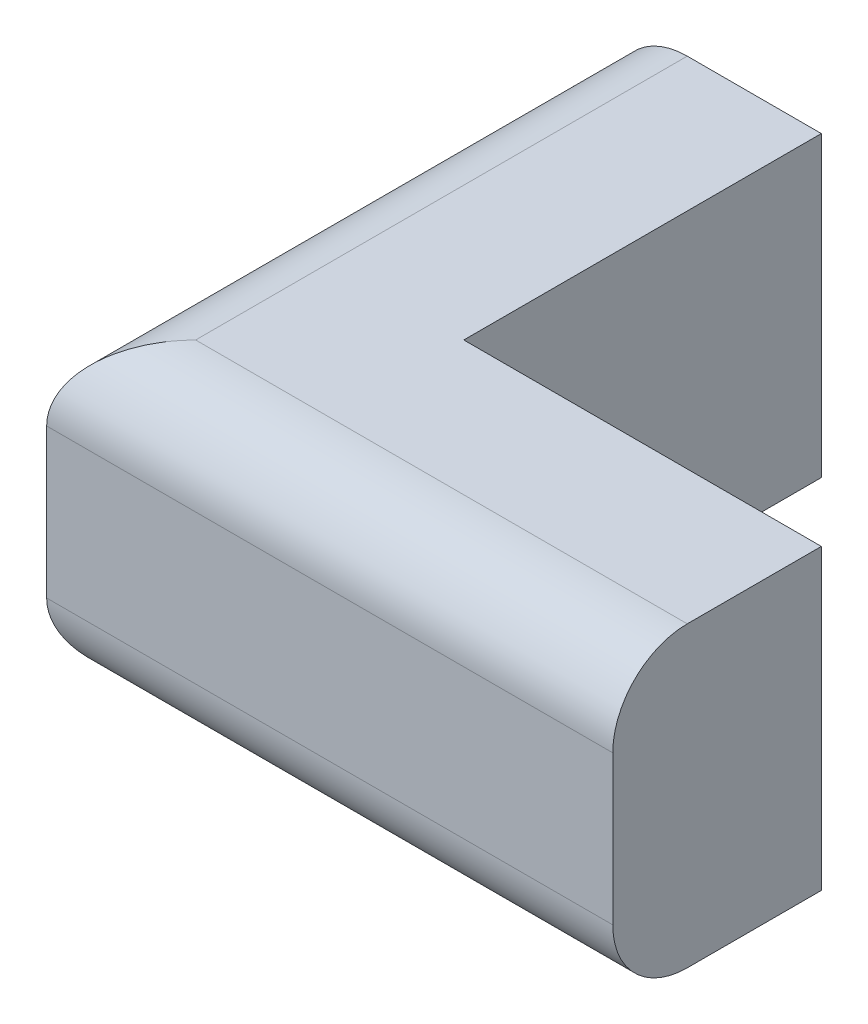
ISO-10303-21;
HEADER;
FILE_DESCRIPTION(('STEP AP214'),'2;1');
FILE_NAME('part.step','',(''),(''),'','','');
FILE_SCHEMA(('AUTOMOTIVE_DESIGN { 1 0 10303 214 1 1 1 1 }'));
ENDSEC;
DATA;
#1=APPLICATION_CONTEXT('core data for automotive mechanical design processes');
#2=APPLICATION_PROTOCOL_DEFINITION('international standard','automotive_design',2000,#1);
#3=PRODUCT_CONTEXT('',#1,'mechanical');
#4=PRODUCT('Part','Part','',(#3));
#5=PRODUCT_RELATED_PRODUCT_CATEGORY('part','',(#4));
#6=PRODUCT_DEFINITION_FORMATION('','',#4);
#7=PRODUCT_DEFINITION_CONTEXT('part definition',#1,'design');
#8=PRODUCT_DEFINITION('design','',#6,#7);
#9=PRODUCT_DEFINITION_SHAPE('','',#8);
#10=(LENGTH_UNIT() NAMED_UNIT(*) SI_UNIT(.MILLI.,.METRE.));
#11=(NAMED_UNIT(*) PLANE_ANGLE_UNIT() SI_UNIT($,.RADIAN.));
#12=(NAMED_UNIT(*) SI_UNIT($,.STERADIAN.) SOLID_ANGLE_UNIT());
#13=UNCERTAINTY_MEASURE_WITH_UNIT(LENGTH_MEASURE(1.E-05),#10,'distance_accuracy_value','');
#14=(GEOMETRIC_REPRESENTATION_CONTEXT(3) GLOBAL_UNCERTAINTY_ASSIGNED_CONTEXT((#13)) GLOBAL_UNIT_ASSIGNED_CONTEXT((#10,
#11,#12)) REPRESENTATION_CONTEXT('',''));
#15=CARTESIAN_POINT('',(0.,0.,0.));
#16=DIRECTION('',(0.,0.,1.));
#17=DIRECTION('',(1.,0.,0.));
#18=AXIS2_PLACEMENT_3D('',#15,#16,#17);
#19=CARTESIAN_POINT('',(0.,127.,-88.9));
#20=DIRECTION('',(0.,0.,-1.));
#21=DIRECTION('',(-1.,0.,0.));
#22=AXIS2_PLACEMENT_3D('',#19,#20,#21);
#23=PLANE('',#22);
#24=DIRECTION('',(1.,0.,0.));
#25=VECTOR('',#24,1.);
#26=CARTESIAN_POINT('',(0.,0.,-88.9));
#27=LINE('',#26,#25);
#28=CARTESIAN_POINT('',(88.9,0.,-88.9));
#29=VERTEX_POINT('',#28);
#30=CARTESIAN_POINT('',(241.3,0.,-88.9));
#31=VERTEX_POINT('',#30);
#32=EDGE_CURVE('E106',#29,#31,#27,.T.);
#33=ORIENTED_EDGE('',*,*,#32,.F.);
#34=DIRECTION('',(0.,-1.,0.));
#35=VECTOR('',#34,1.);
#36=CARTESIAN_POINT('',(88.9,127.,-88.9));
#37=LINE('',#36,#35);
#38=CARTESIAN_POINT('',(88.9,127.,-88.9));
#39=VERTEX_POINT('',#38);
#40=EDGE_CURVE('E101',#39,#29,#37,.T.);
#41=ORIENTED_EDGE('',*,*,#40,.F.);
#42=DIRECTION('',(1.,0.,0.));
#43=VECTOR('',#42,1.);
#44=CARTESIAN_POINT('',(0.,127.,-88.9));
#45=LINE('',#44,#43);
#46=CARTESIAN_POINT('',(241.3,127.,-88.9));
#47=VERTEX_POINT('',#46);
#48=EDGE_CURVE('E104',#39,#47,#45,.T.);
#49=ORIENTED_EDGE('',*,*,#48,.T.);
#50=DIRECTION('',(0.,-1.,0.));
#51=VECTOR('',#50,1.);
#52=CARTESIAN_POINT('',(241.3,127.,-88.9));
#53=LINE('',#52,#51);
#54=EDGE_CURVE('E129',#47,#31,#53,.T.);
#55=ORIENTED_EDGE('',*,*,#54,.T.);
#56=EDGE_LOOP('',(#33,#41,#49,#55));
#57=FACE_BOUND('',#56,.T.);
#58=ADVANCED_FACE('F32',(#57),#23,.T.);
#59=CARTESIAN_POINT('',(88.9,127.,0.));
#60=DIRECTION('',(1.,0.,0.));
#61=DIRECTION('',(0.,0.,-1.));
#62=AXIS2_PLACEMENT_3D('',#59,#60,#61);
#63=PLANE('',#62);
#64=DIRECTION('',(0.,0.,1.));
#65=VECTOR('',#64,1.);
#66=CARTESIAN_POINT('',(88.9,0.,0.));
#67=LINE('',#66,#65);
#68=CARTESIAN_POINT('',(88.9,0.,-241.3));
#69=VERTEX_POINT('',#68);
#70=EDGE_CURVE('E131',#69,#29,#67,.T.);
#71=ORIENTED_EDGE('',*,*,#70,.F.);
#72=DIRECTION('',(0.,-1.,0.));
#73=VECTOR('',#72,1.);
#74=CARTESIAN_POINT('',(88.9,127.,-241.3));
#75=LINE('',#74,#73);
#76=CARTESIAN_POINT('',(88.9,127.,-241.3));
#77=VERTEX_POINT('',#76);
#78=EDGE_CURVE('E112',#77,#69,#75,.T.);
#79=ORIENTED_EDGE('',*,*,#78,.F.);
#80=DIRECTION('',(0.,0.,1.));
#81=VECTOR('',#80,1.);
#82=CARTESIAN_POINT('',(88.9,127.,0.));
#83=LINE('',#82,#81);
#84=EDGE_CURVE('E116',#77,#39,#83,.T.);
#85=ORIENTED_EDGE('',*,*,#84,.T.);
#86=ORIENTED_EDGE('',*,*,#40,.T.);
#87=EDGE_LOOP('',(#71,#79,#85,#86));
#88=FACE_BOUND('',#87,.T.);
#89=ADVANCED_FACE('F122',(#88),#63,.T.);
#90=CARTESIAN_POINT('',(0.,127.,-241.3));
#91=DIRECTION('',(0.,0.,-1.));
#92=DIRECTION('',(-1.,0.,0.));
#93=AXIS2_PLACEMENT_3D('',#90,#91,#92);
#94=PLANE('',#93);
#95=DIRECTION('',(1.,0.,0.));
#96=VECTOR('',#95,1.);
#97=CARTESIAN_POINT('',(0.,0.,-241.3));
#98=LINE('',#97,#96);
#99=CARTESIAN_POINT('',(31.75,0.,-241.3));
#100=VERTEX_POINT('',#99);
#101=EDGE_CURVE('E134',#100,#69,#98,.T.);
#102=ORIENTED_EDGE('',*,*,#101,.F.);
#103=CARTESIAN_POINT('',(31.75,31.75,-241.3));
#104=DIRECTION('',(0.,0.,-1.));
#105=DIRECTION('',(-1.,0.,0.));
#106=AXIS2_PLACEMENT_3D('',#103,#104,#105);
#107=CIRCLE('',#106,31.75);
#108=CARTESIAN_POINT('',(0.,31.75,-241.3));
#109=VERTEX_POINT('',#108);
#110=EDGE_CURVE('E154',#100,#109,#107,.T.);
#111=ORIENTED_EDGE('',*,*,#110,.T.);
#112=DIRECTION('',(0.,-1.,0.));
#113=VECTOR('',#112,1.);
#114=CARTESIAN_POINT('',(0.,127.,-241.3));
#115=LINE('',#114,#113);
#116=CARTESIAN_POINT('',(0.,95.25,-241.3));
#117=VERTEX_POINT('',#116);
#118=EDGE_CURVE('E144',#117,#109,#115,.T.);
#119=ORIENTED_EDGE('',*,*,#118,.F.);
#120=CARTESIAN_POINT('',(31.75,95.25,-241.3));
#121=DIRECTION('',(0.,0.,-1.));
#122=DIRECTION('',(-1.,0.,0.));
#123=AXIS2_PLACEMENT_3D('',#120,#121,#122);
#124=CIRCLE('',#123,31.75);
#125=CARTESIAN_POINT('',(31.75,127.,-241.3));
#126=VERTEX_POINT('',#125);
#127=EDGE_CURVE('E152',#117,#126,#124,.T.);
#128=ORIENTED_EDGE('',*,*,#127,.T.);
#129=DIRECTION('',(1.,0.,0.));
#130=VECTOR('',#129,1.);
#131=CARTESIAN_POINT('',(0.,127.,-241.3));
#132=LINE('',#131,#130);
#133=EDGE_CURVE('E124',#126,#77,#132,.T.);
#134=ORIENTED_EDGE('',*,*,#133,.T.);
#135=ORIENTED_EDGE('',*,*,#78,.T.);
#136=EDGE_LOOP('',(#102,#111,#119,#128,#134,#135));
#137=FACE_BOUND('',#136,.T.);
#138=ADVANCED_FACE('F198',(#137),#94,.T.);
#139=CARTESIAN_POINT('',(0.,127.,0.));
#140=DIRECTION('',(-1.,0.,0.));
#141=DIRECTION('',(0.,0.,1.));
#142=AXIS2_PLACEMENT_3D('',#139,#140,#141);
#143=PLANE('',#142);
#144=ORIENTED_EDGE('',*,*,#118,.T.);
#145=DIRECTION('',(0.,0.,-1.));
#146=VECTOR('',#145,1.);
#147=CARTESIAN_POINT('',(0.,31.75,0.));
#148=LINE('',#147,#146);
#149=CARTESIAN_POINT('',(0.,31.75,0.));
#150=VERTEX_POINT('',#149);
#151=EDGE_CURVE('E159',#109,#150,#148,.F.);
#152=ORIENTED_EDGE('',*,*,#151,.T.);
#153=DIRECTION('',(0.,-1.,0.));
#154=VECTOR('',#153,1.);
#155=CARTESIAN_POINT('',(0.,127.,0.));
#156=LINE('',#155,#154);
#157=CARTESIAN_POINT('',(0.,95.25,0.));
#158=VERTEX_POINT('',#157);
#159=EDGE_CURVE('E141',#158,#150,#156,.T.);
#160=ORIENTED_EDGE('',*,*,#159,.F.);
#161=DIRECTION('',(0.,0.,-1.));
#162=VECTOR('',#161,1.);
#163=CARTESIAN_POINT('',(0.,95.25,0.));
#164=LINE('',#163,#162);
#165=EDGE_CURVE('E156',#158,#117,#164,.T.);
#166=ORIENTED_EDGE('',*,*,#165,.T.);
#167=EDGE_LOOP('',(#144,#152,#160,#166));
#168=FACE_BOUND('',#167,.T.);
#169=ADVANCED_FACE('F201',(#168),#143,.T.);
#170=CARTESIAN_POINT('',(0.,127.,0.));
#171=DIRECTION('',(0.,0.,-1.));
#172=DIRECTION('',(-1.,0.,0.));
#173=AXIS2_PLACEMENT_3D('',#170,#171,#172);
#174=PLANE('',#173);
#175=ORIENTED_EDGE('',*,*,#159,.T.);
#176=DIRECTION('',(1.,0.,0.));
#177=VECTOR('',#176,1.);
#178=CARTESIAN_POINT('',(0.,31.75,0.));
#179=LINE('',#178,#177);
#180=CARTESIAN_POINT('',(241.3,31.75,0.));
#181=VERTEX_POINT('',#180);
#182=EDGE_CURVE('E163',#150,#181,#179,.T.);
#183=ORIENTED_EDGE('',*,*,#182,.T.);
#184=DIRECTION('',(0.,-1.,0.));
#185=VECTOR('',#184,1.);
#186=CARTESIAN_POINT('',(241.3,127.,0.));
#187=LINE('',#186,#185);
#188=CARTESIAN_POINT('',(241.3,95.25,0.));
#189=VERTEX_POINT('',#188);
#190=EDGE_CURVE('E138',#189,#181,#187,.T.);
#191=ORIENTED_EDGE('',*,*,#190,.F.);
#192=DIRECTION('',(1.,0.,0.));
#193=VECTOR('',#192,1.);
#194=CARTESIAN_POINT('',(0.,95.25,0.));
#195=LINE('',#194,#193);
#196=EDGE_CURVE('E161',#189,#158,#195,.F.);
#197=ORIENTED_EDGE('',*,*,#196,.T.);
#198=EDGE_LOOP('',(#175,#183,#191,#197));
#199=FACE_BOUND('',#198,.T.);
#200=ADVANCED_FACE('F187',(#199),#174,.F.);
#201=CARTESIAN_POINT('',(241.3,127.,0.));
#202=DIRECTION('',(-1.,0.,0.));
#203=DIRECTION('',(0.,0.,1.));
#204=AXIS2_PLACEMENT_3D('',#201,#202,#203);
#205=PLANE('',#204);
#206=ORIENTED_EDGE('',*,*,#190,.T.);
#207=CARTESIAN_POINT('',(241.3,31.75,-31.75));
#208=DIRECTION('',(-1.,0.,0.));
#209=DIRECTION('',(0.,0.,1.));
#210=AXIS2_PLACEMENT_3D('',#207,#208,#209);
#211=CIRCLE('',#210,31.75);
#212=CARTESIAN_POINT('',(241.3,0.,-31.75));
#213=VERTEX_POINT('',#212);
#214=EDGE_CURVE('E167',#181,#213,#211,.F.);
#215=ORIENTED_EDGE('',*,*,#214,.T.);
#216=DIRECTION('',(0.,0.,-1.));
#217=VECTOR('',#216,1.);
#218=CARTESIAN_POINT('',(241.3,0.,0.));
#219=LINE('',#218,#217);
#220=EDGE_CURVE('E119',#213,#31,#219,.T.);
#221=ORIENTED_EDGE('',*,*,#220,.T.);
#222=ORIENTED_EDGE('',*,*,#54,.F.);
#223=DIRECTION('',(0.,0.,-1.));
#224=VECTOR('',#223,1.);
#225=CARTESIAN_POINT('',(241.3,127.,0.));
#226=LINE('',#225,#224);
#227=CARTESIAN_POINT('',(241.3,127.,-31.75));
#228=VERTEX_POINT('',#227);
#229=EDGE_CURVE('E117',#228,#47,#226,.T.);
#230=ORIENTED_EDGE('',*,*,#229,.F.);
#231=CARTESIAN_POINT('',(241.3,95.25,-31.75));
#232=DIRECTION('',(-1.,0.,0.));
#233=DIRECTION('',(0.,0.,1.));
#234=AXIS2_PLACEMENT_3D('',#231,#232,#233);
#235=CIRCLE('',#234,31.75);
#236=EDGE_CURVE('E165',#228,#189,#235,.F.);
#237=ORIENTED_EDGE('',*,*,#236,.T.);
#238=EDGE_LOOP('',(#206,#215,#221,#222,#230,#237));
#239=FACE_BOUND('',#238,.T.);
#240=ADVANCED_FACE('F184',(#239),#205,.F.);
#241=CARTESIAN_POINT('',(0.,127.,0.));
#242=DIRECTION('',(0.,1.,0.));
#243=DIRECTION('',(0.,0.,1.));
#244=AXIS2_PLACEMENT_3D('',#241,#242,#243);
#245=PLANE('',#244);
#246=ORIENTED_EDGE('',*,*,#133,.F.);
#247=DIRECTION('',(0.,0.,-1.));
#248=VECTOR('',#247,1.);
#249=CARTESIAN_POINT('',(31.75,127.,0.));
#250=LINE('',#249,#248);
#251=CARTESIAN_POINT('',(31.75,127.,-31.75));
#252=VERTEX_POINT('',#251);
#253=EDGE_CURVE('E11',#126,#252,#250,.F.);
#254=ORIENTED_EDGE('',*,*,#253,.T.);
#255=DIRECTION('',(1.,0.,0.));
#256=VECTOR('',#255,1.);
#257=CARTESIAN_POINT('',(241.3,127.,-31.75));
#258=LINE('',#257,#256);
#259=EDGE_CURVE('E41',#252,#228,#258,.T.);
#260=ORIENTED_EDGE('',*,*,#259,.T.);
#261=ORIENTED_EDGE('',*,*,#229,.T.);
#262=ORIENTED_EDGE('',*,*,#48,.F.);
#263=ORIENTED_EDGE('',*,*,#84,.F.);
#264=EDGE_LOOP('',(#246,#254,#260,#261,#262,#263));
#265=FACE_BOUND('',#264,.T.);
#266=ADVANCED_FACE('F115',(#265),#245,.T.);
#267=CARTESIAN_POINT('',(0.,0.,0.));
#268=DIRECTION('',(0.,1.,0.));
#269=DIRECTION('',(0.,0.,1.));
#270=AXIS2_PLACEMENT_3D('',#267,#268,#269);
#271=PLANE('',#270);
#272=DIRECTION('',(1.,0.,0.));
#273=VECTOR('',#272,1.);
#274=CARTESIAN_POINT('',(0.,0.,-31.75));
#275=LINE('',#274,#273);
#276=CARTESIAN_POINT('',(31.75,0.,-31.75));
#277=VERTEX_POINT('',#276);
#278=EDGE_CURVE('E111',#213,#277,#275,.F.);
#279=ORIENTED_EDGE('',*,*,#278,.T.);
#280=DIRECTION('',(0.,0.,-1.));
#281=VECTOR('',#280,1.);
#282=CARTESIAN_POINT('',(31.75,0.,-241.3));
#283=LINE('',#282,#281);
#284=EDGE_CURVE('E149',#277,#100,#283,.T.);
#285=ORIENTED_EDGE('',*,*,#284,.T.);
#286=ORIENTED_EDGE('',*,*,#101,.T.);
#287=ORIENTED_EDGE('',*,*,#70,.T.);
#288=ORIENTED_EDGE('',*,*,#32,.T.);
#289=ORIENTED_EDGE('',*,*,#220,.F.);
#290=EDGE_LOOP('',(#279,#285,#286,#287,#288,#289));
#291=FACE_BOUND('',#290,.T.);
#292=ADVANCED_FACE('F195',(#291),#271,.F.);
#293=CARTESIAN_POINT('',(0.,31.75,-31.75));
#294=DIRECTION('',(1.,0.,0.));
#295=DIRECTION('',(0.,0.,-1.));
#296=AXIS2_PLACEMENT_3D('',#293,#294,#295);
#297=CYLINDRICAL_SURFACE('',#296,31.75);
#298=ORIENTED_EDGE('',*,*,#214,.F.);
#299=ORIENTED_EDGE('',*,*,#182,.F.);
#300=CARTESIAN_POINT('',(31.75,31.75,-31.75));
#301=DIRECTION('',(0.707106781186547,0.,0.707106781186547));
#302=DIRECTION('',(0.707106781186547,0.,-0.707106781186547));
#303=AXIS2_PLACEMENT_3D('',#300,#301,#302);
#304=ELLIPSE('',#303,44.9012806053458,31.75);
#305=EDGE_CURVE('E132',#277,#150,#304,.F.);
#306=ORIENTED_EDGE('',*,*,#305,.F.);
#307=ORIENTED_EDGE('',*,*,#278,.F.);
#308=EDGE_LOOP('',(#298,#299,#306,#307));
#309=FACE_BOUND('',#308,.T.);
#310=ADVANCED_FACE('F191',(#309),#297,.T.);
#311=CARTESIAN_POINT('',(31.75,31.75,0.));
#312=DIRECTION('',(0.,0.,1.));
#313=DIRECTION('',(1.,0.,0.));
#314=AXIS2_PLACEMENT_3D('',#311,#312,#313);
#315=CYLINDRICAL_SURFACE('',#314,31.75);
#316=ORIENTED_EDGE('',*,*,#305,.T.);
#317=ORIENTED_EDGE('',*,*,#151,.F.);
#318=ORIENTED_EDGE('',*,*,#110,.F.);
#319=ORIENTED_EDGE('',*,*,#284,.F.);
#320=EDGE_LOOP('',(#316,#317,#318,#319));
#321=FACE_BOUND('',#320,.T.);
#322=ADVANCED_FACE('F202',(#321),#315,.T.);
#323=CARTESIAN_POINT('',(0.,95.25,-31.75));
#324=DIRECTION('',(-1.,0.,0.));
#325=DIRECTION('',(0.,0.,1.));
#326=AXIS2_PLACEMENT_3D('',#323,#324,#325);
#327=CYLINDRICAL_SURFACE('',#326,31.75);
#328=ORIENTED_EDGE('',*,*,#236,.F.);
#329=ORIENTED_EDGE('',*,*,#259,.F.);
#330=CARTESIAN_POINT('',(31.75,95.25,-31.75));
#331=DIRECTION('',(-0.707106781186547,0.,-0.707106781186547));
#332=DIRECTION('',(-0.707106781186547,0.,0.707106781186547));
#333=AXIS2_PLACEMENT_3D('',#330,#331,#332);
#334=ELLIPSE('',#333,44.9012806053458,31.75);
#335=EDGE_CURVE('E36',#158,#252,#334,.T.);
#336=ORIENTED_EDGE('',*,*,#335,.F.);
#337=ORIENTED_EDGE('',*,*,#196,.F.);
#338=EDGE_LOOP('',(#328,#329,#336,#337));
#339=FACE_BOUND('',#338,.T.);
#340=ADVANCED_FACE('F34',(#339),#327,.T.);
#341=CARTESIAN_POINT('',(31.75,95.25,0.));
#342=DIRECTION('',(0.,0.,-1.));
#343=DIRECTION('',(-1.,0.,0.));
#344=AXIS2_PLACEMENT_3D('',#341,#342,#343);
#345=CYLINDRICAL_SURFACE('',#344,31.75);
#346=ORIENTED_EDGE('',*,*,#335,.T.);
#347=ORIENTED_EDGE('',*,*,#253,.F.);
#348=ORIENTED_EDGE('',*,*,#127,.F.);
#349=ORIENTED_EDGE('',*,*,#165,.F.);
#350=EDGE_LOOP('',(#346,#347,#348,#349));
#351=FACE_BOUND('',#350,.T.);
#352=ADVANCED_FACE('F178',(#351),#345,.T.);
#353=CLOSED_SHELL('',(#58,#89,#138,#169,#200,#240,#266,#292,#310,#322,#340,#352));
#354=MANIFOLD_SOLID_BREP('B2',#353);
#355=ADVANCED_BREP_SHAPE_REPRESENTATION('',(#18,#354),#14);
#356=SHAPE_DEFINITION_REPRESENTATION(#9,#355);
ENDSEC;
END-ISO-10303-21;
